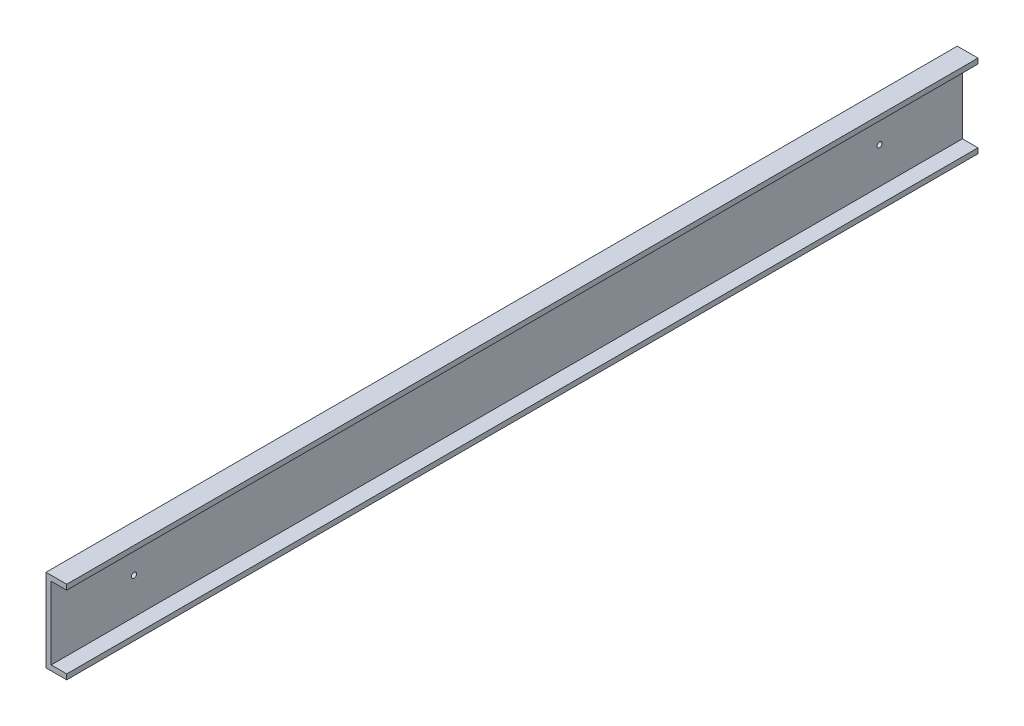
ISO-10303-21;
HEADER;
FILE_DESCRIPTION(('STEP AP214'),'2;1');
FILE_NAME('part.step','',(''),(''),'','','');
FILE_SCHEMA(('AUTOMOTIVE_DESIGN { 1 0 10303 214 1 1 1 1 }'));
ENDSEC;
DATA;
#1=APPLICATION_CONTEXT('core data for automotive mechanical design processes');
#2=APPLICATION_PROTOCOL_DEFINITION('international standard','automotive_design',2000,#1);
#3=PRODUCT_CONTEXT('',#1,'mechanical');
#4=PRODUCT('Part','Part','',(#3));
#5=PRODUCT_RELATED_PRODUCT_CATEGORY('part','',(#4));
#6=PRODUCT_DEFINITION_FORMATION('','',#4);
#7=PRODUCT_DEFINITION_CONTEXT('part definition',#1,'design');
#8=PRODUCT_DEFINITION('design','',#6,#7);
#9=PRODUCT_DEFINITION_SHAPE('','',#8);
#10=(LENGTH_UNIT() NAMED_UNIT(*) SI_UNIT(.MILLI.,.METRE.));
#11=(NAMED_UNIT(*) PLANE_ANGLE_UNIT() SI_UNIT($,.RADIAN.));
#12=(NAMED_UNIT(*) SI_UNIT($,.STERADIAN.) SOLID_ANGLE_UNIT());
#13=UNCERTAINTY_MEASURE_WITH_UNIT(LENGTH_MEASURE(1.E-05),#10,'distance_accuracy_value','');
#14=(GEOMETRIC_REPRESENTATION_CONTEXT(3) GLOBAL_UNCERTAINTY_ASSIGNED_CONTEXT((#13)) GLOBAL_UNIT_ASSIGNED_CONTEXT((#10,
#11,#12)) REPRESENTATION_CONTEXT('',''));
#15=CARTESIAN_POINT('',(0.,0.,0.));
#16=DIRECTION('',(0.,0.,1.));
#17=DIRECTION('',(1.,0.,0.));
#18=AXIS2_PLACEMENT_3D('',#15,#16,#17);
#19=CARTESIAN_POINT('',(6.35,-25.4,-279.4));
#20=DIRECTION('',(1.,0.,0.));
#21=DIRECTION('',(0.,0.,-1.));
#22=AXIS2_PLACEMENT_3D('',#19,#20,#21);
#23=PLANE('',#22);
#24=DIRECTION('',(0.,0.,-1.));
#25=VECTOR('',#24,1.);
#26=CARTESIAN_POINT('',(6.35,-25.4,-279.4));
#27=LINE('',#26,#25);
#28=CARTESIAN_POINT('',(6.35,-25.4,-279.4));
#29=VERTEX_POINT('',#28);
#30=CARTESIAN_POINT('',(6.35,-25.4,279.4));
#31=VERTEX_POINT('',#30);
#32=EDGE_CURVE('E83',#29,#31,#27,.F.);
#33=ORIENTED_EDGE('',*,*,#32,.F.);
#34=DIRECTION('',(0.,1.,0.));
#35=VECTOR('',#34,1.);
#36=CARTESIAN_POINT('',(6.35,0.,-279.4));
#37=LINE('',#36,#35);
#38=CARTESIAN_POINT('',(6.35,-22.225,-279.4));
#39=VERTEX_POINT('',#38);
#40=EDGE_CURVE('E140',#29,#39,#37,.T.);
#41=ORIENTED_EDGE('',*,*,#40,.T.);
#42=DIRECTION('',(0.,0.,1.));
#43=VECTOR('',#42,1.);
#44=CARTESIAN_POINT('',(6.35,-22.225,-279.4));
#45=LINE('',#44,#43);
#46=CARTESIAN_POINT('',(6.35,-22.225,279.4));
#47=VERTEX_POINT('',#46);
#48=EDGE_CURVE('E78',#47,#39,#45,.F.);
#49=ORIENTED_EDGE('',*,*,#48,.F.);
#50=DIRECTION('',(0.,1.,0.));
#51=VECTOR('',#50,1.);
#52=CARTESIAN_POINT('',(6.35,0.,279.4));
#53=LINE('',#52,#51);
#54=EDGE_CURVE('E94',#31,#47,#53,.T.);
#55=ORIENTED_EDGE('',*,*,#54,.F.);
#56=EDGE_LOOP('',(#33,#41,#49,#55));
#57=FACE_BOUND('',#56,.T.);
#58=ADVANCED_FACE('F16',(#57),#23,.T.);
#59=CARTESIAN_POINT('',(6.35,-22.225,-279.4));
#60=DIRECTION('',(0.,1.,0.));
#61=DIRECTION('',(0.,0.,1.));
#62=AXIS2_PLACEMENT_3D('',#59,#60,#61);
#63=PLANE('',#62);
#64=ORIENTED_EDGE('',*,*,#48,.T.);
#65=DIRECTION('',(1.,0.,0.));
#66=VECTOR('',#65,1.);
#67=CARTESIAN_POINT('',(0.,-22.225,-279.4));
#68=LINE('',#67,#66);
#69=CARTESIAN_POINT('',(-3.175,-22.225,-279.4));
#70=VERTEX_POINT('',#69);
#71=EDGE_CURVE('E138',#39,#70,#68,.F.);
#72=ORIENTED_EDGE('',*,*,#71,.T.);
#73=DIRECTION('',(0.,0.,-1.));
#74=VECTOR('',#73,1.);
#75=CARTESIAN_POINT('',(-3.175,-22.225,-279.4));
#76=LINE('',#75,#74);
#77=CARTESIAN_POINT('',(-3.175,-22.225,279.4));
#78=VERTEX_POINT('',#77);
#79=EDGE_CURVE('E91',#78,#70,#76,.T.);
#80=ORIENTED_EDGE('',*,*,#79,.F.);
#81=DIRECTION('',(1.,0.,0.));
#82=VECTOR('',#81,1.);
#83=CARTESIAN_POINT('',(0.,-22.225,279.4));
#84=LINE('',#83,#82);
#85=EDGE_CURVE('E97',#47,#78,#84,.F.);
#86=ORIENTED_EDGE('',*,*,#85,.F.);
#87=EDGE_LOOP('',(#64,#72,#80,#86));
#88=FACE_BOUND('',#87,.T.);
#89=ADVANCED_FACE('F158',(#88),#63,.T.);
#90=CARTESIAN_POINT('',(-3.175,22.225,-279.4));
#91=DIRECTION('',(0.,-1.,0.));
#92=DIRECTION('',(0.,0.,-1.));
#93=AXIS2_PLACEMENT_3D('',#90,#91,#92);
#94=PLANE('',#93);
#95=DIRECTION('',(0.,0.,-1.));
#96=VECTOR('',#95,1.);
#97=CARTESIAN_POINT('',(-3.175,22.225,-279.4));
#98=LINE('',#97,#96);
#99=CARTESIAN_POINT('',(-3.175,22.225,-279.4));
#100=VERTEX_POINT('',#99);
#101=CARTESIAN_POINT('',(-3.175,22.225,279.4));
#102=VERTEX_POINT('',#101);
#103=EDGE_CURVE('E108',#100,#102,#98,.F.);
#104=ORIENTED_EDGE('',*,*,#103,.F.);
#105=DIRECTION('',(1.,0.,0.));
#106=VECTOR('',#105,1.);
#107=CARTESIAN_POINT('',(0.,22.225,-279.4));
#108=LINE('',#107,#106);
#109=CARTESIAN_POINT('',(6.35,22.225,-279.4));
#110=VERTEX_POINT('',#109);
#111=EDGE_CURVE('E127',#100,#110,#108,.T.);
#112=ORIENTED_EDGE('',*,*,#111,.T.);
#113=DIRECTION('',(0.,0.,-1.));
#114=VECTOR('',#113,1.);
#115=CARTESIAN_POINT('',(6.35,22.225,-279.4));
#116=LINE('',#115,#114);
#117=CARTESIAN_POINT('',(6.35,22.225,279.4));
#118=VERTEX_POINT('',#117);
#119=EDGE_CURVE('E110',#118,#110,#116,.T.);
#120=ORIENTED_EDGE('',*,*,#119,.F.);
#121=DIRECTION('',(1.,0.,0.));
#122=VECTOR('',#121,1.);
#123=CARTESIAN_POINT('',(0.,22.225,279.4));
#124=LINE('',#123,#122);
#125=EDGE_CURVE('E151',#102,#118,#124,.T.);
#126=ORIENTED_EDGE('',*,*,#125,.F.);
#127=EDGE_LOOP('',(#104,#112,#120,#126));
#128=FACE_BOUND('',#127,.T.);
#129=ADVANCED_FACE('F166',(#128),#94,.T.);
#130=CARTESIAN_POINT('',(6.35,22.225,-279.4));
#131=DIRECTION('',(1.,0.,0.));
#132=DIRECTION('',(0.,0.,-1.));
#133=AXIS2_PLACEMENT_3D('',#130,#131,#132);
#134=PLANE('',#133);
#135=ORIENTED_EDGE('',*,*,#119,.T.);
#136=DIRECTION('',(0.,1.,0.));
#137=VECTOR('',#136,1.);
#138=CARTESIAN_POINT('',(6.35,0.,-279.4));
#139=LINE('',#138,#137);
#140=CARTESIAN_POINT('',(6.35,25.4,-279.4));
#141=VERTEX_POINT('',#140);
#142=EDGE_CURVE('E123',#110,#141,#139,.T.);
#143=ORIENTED_EDGE('',*,*,#142,.T.);
#144=DIRECTION('',(0.,0.,1.));
#145=VECTOR('',#144,1.);
#146=CARTESIAN_POINT('',(6.35,25.4,-279.4));
#147=LINE('',#146,#145);
#148=CARTESIAN_POINT('',(6.35,25.4,279.4));
#149=VERTEX_POINT('',#148);
#150=EDGE_CURVE('E144',#149,#141,#147,.F.);
#151=ORIENTED_EDGE('',*,*,#150,.F.);
#152=DIRECTION('',(0.,1.,0.));
#153=VECTOR('',#152,1.);
#154=CARTESIAN_POINT('',(6.35,0.,279.4));
#155=LINE('',#154,#153);
#156=EDGE_CURVE('E149',#118,#149,#155,.T.);
#157=ORIENTED_EDGE('',*,*,#156,.F.);
#158=EDGE_LOOP('',(#135,#143,#151,#157));
#159=FACE_BOUND('',#158,.T.);
#160=ADVANCED_FACE('F168',(#159),#134,.T.);
#161=CARTESIAN_POINT('',(-3.175,-22.225,-279.4));
#162=DIRECTION('',(1.,0.,0.));
#163=DIRECTION('',(0.,0.,-1.));
#164=AXIS2_PLACEMENT_3D('',#161,#162,#163);
#165=PLANE('',#164);
#166=CARTESIAN_POINT('',(-3.175,0.,-228.6));
#167=DIRECTION('',(1.,0.,0.));
#168=DIRECTION('',(0.,0.,-1.));
#169=AXIS2_PLACEMENT_3D('',#166,#167,#168);
#170=CIRCLE('',#169,1.5875);
#171=CARTESIAN_POINT('',(-3.175,0.,-230.1875));
#172=VERTEX_POINT('',#171);
#173=EDGE_CURVE('E116',#172,#172,#170,.F.);
#174=ORIENTED_EDGE('',*,*,#173,.T.);
#175=EDGE_LOOP('',(#174));
#176=FACE_BOUND('',#175,.T.);
#177=CARTESIAN_POINT('',(-3.175,0.,228.6));
#178=DIRECTION('',(1.,0.,0.));
#179=DIRECTION('',(0.,0.,-1.));
#180=AXIS2_PLACEMENT_3D('',#177,#178,#179);
#181=CIRCLE('',#180,1.5875);
#182=CARTESIAN_POINT('',(-3.175,0.,227.0125));
#183=VERTEX_POINT('',#182);
#184=EDGE_CURVE('E19',#183,#183,#181,.F.);
#185=ORIENTED_EDGE('',*,*,#184,.T.);
#186=EDGE_LOOP('',(#185));
#187=FACE_BOUND('',#186,.T.);
#188=ORIENTED_EDGE('',*,*,#79,.T.);
#189=DIRECTION('',(0.,1.,0.));
#190=VECTOR('',#189,1.);
#191=CARTESIAN_POINT('',(-3.175,0.,-279.4));
#192=LINE('',#191,#190);
#193=EDGE_CURVE('E132',#70,#100,#192,.T.);
#194=ORIENTED_EDGE('',*,*,#193,.T.);
#195=ORIENTED_EDGE('',*,*,#103,.T.);
#196=DIRECTION('',(0.,1.,0.));
#197=VECTOR('',#196,1.);
#198=CARTESIAN_POINT('',(-3.175,0.,279.4));
#199=LINE('',#198,#197);
#200=EDGE_CURVE('E154',#78,#102,#199,.T.);
#201=ORIENTED_EDGE('',*,*,#200,.F.);
#202=EDGE_LOOP('',(#188,#194,#195,#201));
#203=FACE_BOUND('',#202,.T.);
#204=ADVANCED_FACE('F162',(#176,#187,#203),#165,.T.);
#205=CARTESIAN_POINT('',(-6.35,-25.4,-279.4));
#206=DIRECTION('',(0.,-1.,0.));
#207=DIRECTION('',(0.,0.,-1.));
#208=AXIS2_PLACEMENT_3D('',#205,#206,#207);
#209=PLANE('',#208);
#210=DIRECTION('',(0.,0.,1.));
#211=VECTOR('',#210,1.);
#212=CARTESIAN_POINT('',(-6.35,-25.4,-279.4));
#213=LINE('',#212,#211);
#214=CARTESIAN_POINT('',(-6.35,-25.4,-279.4));
#215=VERTEX_POINT('',#214);
#216=CARTESIAN_POINT('',(-6.35,-25.4,279.4));
#217=VERTEX_POINT('',#216);
#218=EDGE_CURVE('E118',#215,#217,#213,.T.);
#219=ORIENTED_EDGE('',*,*,#218,.F.);
#220=DIRECTION('',(1.,0.,0.));
#221=VECTOR('',#220,1.);
#222=CARTESIAN_POINT('',(0.,-25.4,-279.4));
#223=LINE('',#222,#221);
#224=EDGE_CURVE('E89',#215,#29,#223,.T.);
#225=ORIENTED_EDGE('',*,*,#224,.T.);
#226=ORIENTED_EDGE('',*,*,#32,.T.);
#227=DIRECTION('',(1.,0.,0.));
#228=VECTOR('',#227,1.);
#229=CARTESIAN_POINT('',(0.,-25.4,279.4));
#230=LINE('',#229,#228);
#231=EDGE_CURVE('E86',#217,#31,#230,.T.);
#232=ORIENTED_EDGE('',*,*,#231,.F.);
#233=EDGE_LOOP('',(#219,#225,#226,#232));
#234=FACE_BOUND('',#233,.T.);
#235=ADVANCED_FACE('F84',(#234),#209,.T.);
#236=CARTESIAN_POINT('',(0.,0.,279.4));
#237=DIRECTION('',(0.,0.,1.));
#238=DIRECTION('',(1.,0.,0.));
#239=AXIS2_PLACEMENT_3D('',#236,#237,#238);
#240=PLANE('',#239);
#241=ORIENTED_EDGE('',*,*,#156,.T.);
#242=DIRECTION('',(1.,0.,0.));
#243=VECTOR('',#242,1.);
#244=CARTESIAN_POINT('',(6.35,25.4,279.4));
#245=LINE('',#244,#243);
#246=CARTESIAN_POINT('',(-6.35,25.4,279.4));
#247=VERTEX_POINT('',#246);
#248=EDGE_CURVE('E146',#247,#149,#245,.T.);
#249=ORIENTED_EDGE('',*,*,#248,.F.);
#250=DIRECTION('',(0.,1.,0.));
#251=VECTOR('',#250,1.);
#252=CARTESIAN_POINT('',(-6.35,25.4,279.4));
#253=LINE('',#252,#251);
#254=EDGE_CURVE('E101',#217,#247,#253,.T.);
#255=ORIENTED_EDGE('',*,*,#254,.F.);
#256=ORIENTED_EDGE('',*,*,#231,.T.);
#257=ORIENTED_EDGE('',*,*,#54,.T.);
#258=ORIENTED_EDGE('',*,*,#85,.T.);
#259=ORIENTED_EDGE('',*,*,#200,.T.);
#260=ORIENTED_EDGE('',*,*,#125,.T.);
#261=EDGE_LOOP('',(#241,#249,#255,#256,#257,#258,#259,#260));
#262=FACE_BOUND('',#261,.T.);
#263=ADVANCED_FACE('F99',(#262),#240,.T.);
#264=CARTESIAN_POINT('',(6.35,25.4,-279.4));
#265=DIRECTION('',(0.,1.,0.));
#266=DIRECTION('',(0.,0.,1.));
#267=AXIS2_PLACEMENT_3D('',#264,#265,#266);
#268=PLANE('',#267);
#269=ORIENTED_EDGE('',*,*,#150,.T.);
#270=DIRECTION('',(1.,0.,0.));
#271=VECTOR('',#270,1.);
#272=CARTESIAN_POINT('',(0.,25.4,-279.4));
#273=LINE('',#272,#271);
#274=CARTESIAN_POINT('',(-6.35,25.4,-279.4));
#275=VERTEX_POINT('',#274);
#276=EDGE_CURVE('E34',#141,#275,#273,.F.);
#277=ORIENTED_EDGE('',*,*,#276,.T.);
#278=DIRECTION('',(0.,0.,1.));
#279=VECTOR('',#278,1.);
#280=CARTESIAN_POINT('',(-6.35,25.4,-279.4));
#281=LINE('',#280,#279);
#282=EDGE_CURVE('E171',#247,#275,#281,.F.);
#283=ORIENTED_EDGE('',*,*,#282,.F.);
#284=ORIENTED_EDGE('',*,*,#248,.T.);
#285=EDGE_LOOP('',(#269,#277,#283,#284));
#286=FACE_BOUND('',#285,.T.);
#287=ADVANCED_FACE('F169',(#286),#268,.T.);
#288=CARTESIAN_POINT('',(0.,0.,-279.4));
#289=DIRECTION('',(0.,0.,1.));
#290=DIRECTION('',(1.,0.,0.));
#291=AXIS2_PLACEMENT_3D('',#288,#289,#290);
#292=PLANE('',#291);
#293=ORIENTED_EDGE('',*,*,#111,.F.);
#294=ORIENTED_EDGE('',*,*,#193,.F.);
#295=ORIENTED_EDGE('',*,*,#71,.F.);
#296=ORIENTED_EDGE('',*,*,#40,.F.);
#297=ORIENTED_EDGE('',*,*,#224,.F.);
#298=DIRECTION('',(0.,1.,0.));
#299=VECTOR('',#298,1.);
#300=CARTESIAN_POINT('',(-6.35,25.4,-279.4));
#301=LINE('',#300,#299);
#302=EDGE_CURVE('E115',#275,#215,#301,.F.);
#303=ORIENTED_EDGE('',*,*,#302,.F.);
#304=ORIENTED_EDGE('',*,*,#276,.F.);
#305=ORIENTED_EDGE('',*,*,#142,.F.);
#306=EDGE_LOOP('',(#293,#294,#295,#296,#297,#303,#304,#305));
#307=FACE_BOUND('',#306,.T.);
#308=ADVANCED_FACE('F178',(#307),#292,.F.);
#309=CARTESIAN_POINT('',(-3.175,0.,228.6));
#310=DIRECTION('',(1.,0.,0.));
#311=DIRECTION('',(0.,0.,-1.));
#312=AXIS2_PLACEMENT_3D('',#309,#310,#311);
#313=CYLINDRICAL_SURFACE('',#312,1.5875);
#314=ORIENTED_EDGE('',*,*,#184,.F.);
#315=EDGE_LOOP('',(#314));
#316=FACE_BOUND('',#315,.T.);
#317=CARTESIAN_POINT('',(-6.35,0.,228.6));
#318=DIRECTION('',(1.,0.,0.));
#319=DIRECTION('',(0.,0.,-1.));
#320=AXIS2_PLACEMENT_3D('',#317,#318,#319);
#321=CIRCLE('',#320,1.5875);
#322=CARTESIAN_POINT('',(-6.35,0.,227.0125));
#323=VERTEX_POINT('',#322);
#324=EDGE_CURVE('E25',#323,#323,#321,.T.);
#325=ORIENTED_EDGE('',*,*,#324,.F.);
#326=EDGE_LOOP('',(#325));
#327=FACE_BOUND('',#326,.T.);
#328=ADVANCED_FACE('F180',(#316,#327),#313,.F.);
#329=CARTESIAN_POINT('',(-3.175,0.,-228.6));
#330=DIRECTION('',(1.,0.,0.));
#331=DIRECTION('',(0.,0.,-1.));
#332=AXIS2_PLACEMENT_3D('',#329,#330,#331);
#333=CYLINDRICAL_SURFACE('',#332,1.5875);
#334=ORIENTED_EDGE('',*,*,#173,.F.);
#335=EDGE_LOOP('',(#334));
#336=FACE_BOUND('',#335,.T.);
#337=CARTESIAN_POINT('',(-6.35,0.,-228.6));
#338=DIRECTION('',(1.,0.,0.));
#339=DIRECTION('',(0.,0.,-1.));
#340=AXIS2_PLACEMENT_3D('',#337,#338,#339);
#341=CIRCLE('',#340,1.5875);
#342=CARTESIAN_POINT('',(-6.35,0.,-230.1875));
#343=VERTEX_POINT('',#342);
#344=EDGE_CURVE('E11',#343,#343,#341,.T.);
#345=ORIENTED_EDGE('',*,*,#344,.F.);
#346=EDGE_LOOP('',(#345));
#347=FACE_BOUND('',#346,.T.);
#348=ADVANCED_FACE('F187',(#336,#347),#333,.F.);
#349=CARTESIAN_POINT('',(-6.35,25.4,-279.4));
#350=DIRECTION('',(-1.,0.,0.));
#351=DIRECTION('',(0.,0.,1.));
#352=AXIS2_PLACEMENT_3D('',#349,#350,#351);
#353=PLANE('',#352);
#354=ORIENTED_EDGE('',*,*,#344,.T.);
#355=EDGE_LOOP('',(#354));
#356=FACE_BOUND('',#355,.T.);
#357=ORIENTED_EDGE('',*,*,#324,.T.);
#358=EDGE_LOOP('',(#357));
#359=FACE_BOUND('',#358,.T.);
#360=ORIENTED_EDGE('',*,*,#282,.T.);
#361=ORIENTED_EDGE('',*,*,#302,.T.);
#362=ORIENTED_EDGE('',*,*,#218,.T.);
#363=ORIENTED_EDGE('',*,*,#254,.T.);
#364=EDGE_LOOP('',(#360,#361,#362,#363));
#365=FACE_BOUND('',#364,.T.);
#366=ADVANCED_FACE('F175',(#356,#359,#365),#353,.T.);
#367=CLOSED_SHELL('',(#58,#89,#129,#160,#204,#235,#263,#287,#308,#328,#348,#366));
#368=MANIFOLD_SOLID_BREP('B1',#367);
#369=ADVANCED_BREP_SHAPE_REPRESENTATION('',(#18,#368),#14);
#370=SHAPE_DEFINITION_REPRESENTATION(#9,#369);
ENDSEC;
END-ISO-10303-21;
